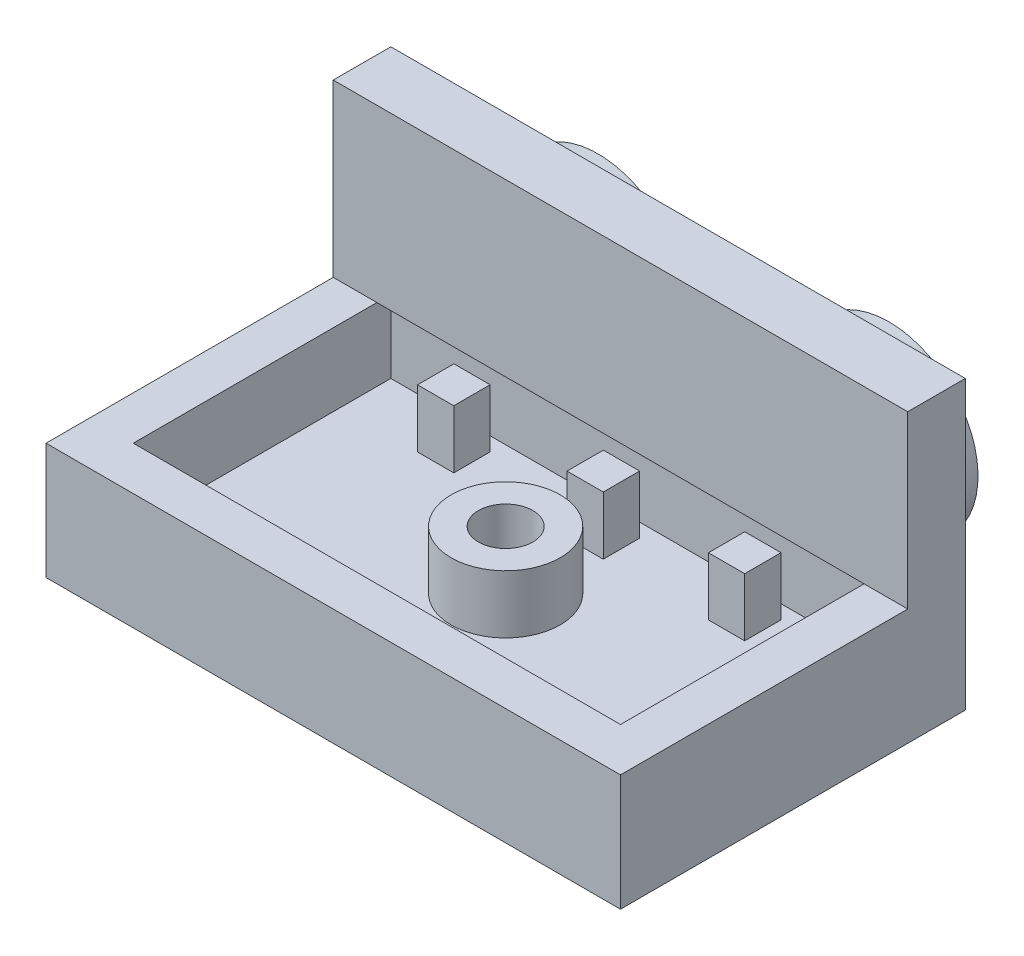
ISO-10303-21;
HEADER;
FILE_DESCRIPTION(('STEP AP214'),'2;1');
FILE_NAME('part.step','',(''),(''),'','','');
FILE_SCHEMA(('AUTOMOTIVE_DESIGN { 1 0 10303 214 1 1 1 1 }'));
ENDSEC;
DATA;
#1=APPLICATION_CONTEXT('core data for automotive mechanical design processes');
#2=APPLICATION_PROTOCOL_DEFINITION('international standard','automotive_design',2000,#1);
#3=PRODUCT_CONTEXT('',#1,'mechanical');
#4=PRODUCT('Part','Part','',(#3));
#5=PRODUCT_RELATED_PRODUCT_CATEGORY('part','',(#4));
#6=PRODUCT_DEFINITION_FORMATION('','',#4);
#7=PRODUCT_DEFINITION_CONTEXT('part definition',#1,'design');
#8=PRODUCT_DEFINITION('design','',#6,#7);
#9=PRODUCT_DEFINITION_SHAPE('','',#8);
#10=(LENGTH_UNIT() NAMED_UNIT(*) SI_UNIT(.MILLI.,.METRE.));
#11=(NAMED_UNIT(*) PLANE_ANGLE_UNIT() SI_UNIT($,.RADIAN.));
#12=(NAMED_UNIT(*) SI_UNIT($,.STERADIAN.) SOLID_ANGLE_UNIT());
#13=UNCERTAINTY_MEASURE_WITH_UNIT(LENGTH_MEASURE(1.E-05),#10,'distance_accuracy_value','');
#14=(GEOMETRIC_REPRESENTATION_CONTEXT(3) GLOBAL_UNCERTAINTY_ASSIGNED_CONTEXT((#13)) GLOBAL_UNIT_ASSIGNED_CONTEXT((#10,
#11,#12)) REPRESENTATION_CONTEXT('',''));
#15=CARTESIAN_POINT('',(0.,0.,0.));
#16=DIRECTION('',(0.,0.,1.));
#17=DIRECTION('',(1.,0.,0.));
#18=AXIS2_PLACEMENT_3D('',#15,#16,#17);
#19=CARTESIAN_POINT('',(0.681967213114738,3.2,7.9));
#20=DIRECTION('',(0.,-1.,0.));
#21=DIRECTION('',(0.,0.,-1.));
#22=AXIS2_PLACEMENT_3D('',#19,#20,#21);
#23=PLANE('',#22);
#24=DIRECTION('',(0.,0.,-1.));
#25=VECTOR('',#24,1.);
#26=CARTESIAN_POINT('',(15.2819672131147,3.2,7.9));
#27=LINE('',#26,#25);
#28=CARTESIAN_POINT('',(15.2819672131147,3.2,6.7));
#29=VERTEX_POINT('',#28);
#30=CARTESIAN_POINT('',(15.2819672131147,3.2,0.));
#31=VERTEX_POINT('',#30);
#32=EDGE_CURVE('E295',#29,#31,#27,.T.);
#33=ORIENTED_EDGE('',*,*,#32,.F.);
#34=DIRECTION('',(-1.,0.,0.));
#35=VECTOR('',#34,1.);
#36=CARTESIAN_POINT('',(0.,3.2,6.7));
#37=LINE('',#36,#35);
#38=CARTESIAN_POINT('',(1.88196721311474,3.2,6.7));
#39=VERTEX_POINT('',#38);
#40=EDGE_CURVE('E303',#29,#39,#37,.T.);
#41=ORIENTED_EDGE('',*,*,#40,.T.);
#42=DIRECTION('',(0.,0.,-1.));
#43=VECTOR('',#42,1.);
#44=CARTESIAN_POINT('',(1.88196721311474,3.2,7.9));
#45=LINE('',#44,#43);
#46=CARTESIAN_POINT('',(1.88196721311474,3.2,0.));
#47=VERTEX_POINT('',#46);
#48=EDGE_CURVE('E319',#39,#47,#45,.T.);
#49=ORIENTED_EDGE('',*,*,#48,.T.);
#50=DIRECTION('',(1.,0.,0.));
#51=VECTOR('',#50,1.);
#52=CARTESIAN_POINT('',(0.681967213114738,3.2,0.));
#53=LINE('',#52,#51);
#54=CARTESIAN_POINT('',(0.681967213114738,3.2,0.));
#55=VERTEX_POINT('',#54);
#56=EDGE_CURVE('E386',#55,#47,#53,.T.);
#57=ORIENTED_EDGE('',*,*,#56,.F.);
#58=DIRECTION('',(0.,0.,-1.));
#59=VECTOR('',#58,1.);
#60=CARTESIAN_POINT('',(0.681967213114738,3.2,7.9));
#61=LINE('',#60,#59);
#62=CARTESIAN_POINT('',(0.681967213114738,3.2,7.9));
#63=VERTEX_POINT('',#62);
#64=EDGE_CURVE('E375',#63,#55,#61,.T.);
#65=ORIENTED_EDGE('',*,*,#64,.F.);
#66=DIRECTION('',(-1.,0.,0.));
#67=VECTOR('',#66,1.);
#68=CARTESIAN_POINT('',(0.681967213114738,3.2,7.9));
#69=LINE('',#68,#67);
#70=CARTESIAN_POINT('',(16.4819672131147,3.2,7.9));
#71=VERTEX_POINT('',#70);
#72=EDGE_CURVE('E373',#71,#63,#69,.T.);
#73=ORIENTED_EDGE('',*,*,#72,.F.);
#74=DIRECTION('',(0.,0.,-1.));
#75=VECTOR('',#74,1.);
#76=CARTESIAN_POINT('',(16.4819672131147,3.2,7.9));
#77=LINE('',#76,#75);
#78=CARTESIAN_POINT('',(16.4819672131147,3.2,0.));
#79=VERTEX_POINT('',#78);
#80=EDGE_CURVE('E378',#71,#79,#77,.T.);
#81=ORIENTED_EDGE('',*,*,#80,.T.);
#82=EDGE_CURVE('E385',#31,#79,#53,.T.);
#83=ORIENTED_EDGE('',*,*,#82,.F.);
#84=EDGE_LOOP('',(#33,#41,#49,#57,#65,#73,#81,#83));
#85=FACE_BOUND('',#84,.T.);
#86=ADVANCED_FACE('F47',(#85),#23,.F.);
#87=CARTESIAN_POINT('',(16.4819672131147,0.,7.9));
#88=DIRECTION('',(-1.,0.,0.));
#89=DIRECTION('',(0.,0.,1.));
#90=AXIS2_PLACEMENT_3D('',#87,#88,#89);
#91=PLANE('',#90);
#92=DIRECTION('',(0.,0.,-1.));
#93=VECTOR('',#92,1.);
#94=CARTESIAN_POINT('',(16.4819672131147,0.,7.9));
#95=LINE('',#94,#93);
#96=CARTESIAN_POINT('',(16.4819672131147,0.,7.9));
#97=VERTEX_POINT('',#96);
#98=CARTESIAN_POINT('',(16.4819672131147,0.,-1.58374582752892));
#99=VERTEX_POINT('',#98);
#100=EDGE_CURVE('E381',#97,#99,#95,.T.);
#101=ORIENTED_EDGE('',*,*,#100,.T.);
#102=DIRECTION('',(0.,1.,0.));
#103=VECTOR('',#102,1.);
#104=CARTESIAN_POINT('',(16.4819672131147,7.9,-1.58374582752892));
#105=LINE('',#104,#103);
#106=CARTESIAN_POINT('',(16.4819672131147,7.9,-1.58374582752892));
#107=VERTEX_POINT('',#106);
#108=EDGE_CURVE('E345',#99,#107,#105,.T.);
#109=ORIENTED_EDGE('',*,*,#108,.T.);
#110=DIRECTION('',(0.,0.,1.));
#111=VECTOR('',#110,1.);
#112=CARTESIAN_POINT('',(16.4819672131147,7.9,-1.58374582752892));
#113=LINE('',#112,#111);
#114=CARTESIAN_POINT('',(16.4819672131147,7.9,0.));
#115=VERTEX_POINT('',#114);
#116=EDGE_CURVE('E351',#107,#115,#113,.T.);
#117=ORIENTED_EDGE('',*,*,#116,.T.);
#118=DIRECTION('',(0.,-1.,0.));
#119=VECTOR('',#118,1.);
#120=CARTESIAN_POINT('',(16.4819672131147,0.,0.));
#121=LINE('',#120,#119);
#122=EDGE_CURVE('E361',#115,#79,#121,.T.);
#123=ORIENTED_EDGE('',*,*,#122,.T.);
#124=ORIENTED_EDGE('',*,*,#80,.F.);
#125=DIRECTION('',(0.,1.,0.));
#126=VECTOR('',#125,1.);
#127=CARTESIAN_POINT('',(16.4819672131147,0.,7.9));
#128=LINE('',#127,#126);
#129=EDGE_CURVE('E371',#97,#71,#128,.T.);
#130=ORIENTED_EDGE('',*,*,#129,.F.);
#131=EDGE_LOOP('',(#101,#109,#117,#123,#124,#130));
#132=FACE_BOUND('',#131,.T.);
#133=ADVANCED_FACE('F410',(#132),#91,.F.);
#134=CARTESIAN_POINT('',(0.681967213114738,0.,7.9));
#135=DIRECTION('',(0.,1.,0.));
#136=DIRECTION('',(0.,0.,1.));
#137=AXIS2_PLACEMENT_3D('',#134,#135,#136);
#138=PLANE('',#137);
#139=CARTESIAN_POINT('',(12.5819672131147,0.,3.15812708623554));
#140=DIRECTION('',(0.,1.,0.));
#141=DIRECTION('',(0.,0.,1.));
#142=AXIS2_PLACEMENT_3D('',#139,#140,#141);
#143=CIRCLE('',#142,2.4);
#144=CARTESIAN_POINT('',(12.5819672131147,0.,5.55812708623554));
#145=VERTEX_POINT('',#144);
#146=EDGE_CURVE('E12',#145,#145,#143,.F.);
#147=ORIENTED_EDGE('',*,*,#146,.F.);
#148=EDGE_LOOP('',(#147));
#149=FACE_BOUND('',#148,.T.);
#150=CARTESIAN_POINT('',(4.58196721311474,0.,3.15812708623554));
#151=DIRECTION('',(0.,1.,0.));
#152=DIRECTION('',(0.,0.,1.));
#153=AXIS2_PLACEMENT_3D('',#150,#151,#152);
#154=CIRCLE('',#153,2.4);
#155=CARTESIAN_POINT('',(4.58196721311474,0.,5.55812708623554));
#156=VERTEX_POINT('',#155);
#157=EDGE_CURVE('E55',#156,#156,#154,.F.);
#158=ORIENTED_EDGE('',*,*,#157,.F.);
#159=EDGE_LOOP('',(#158));
#160=FACE_BOUND('',#159,.T.);
#161=DIRECTION('',(0.,0.,-1.));
#162=VECTOR('',#161,1.);
#163=CARTESIAN_POINT('',(0.681967213114738,0.,7.9));
#164=LINE('',#163,#162);
#165=CARTESIAN_POINT('',(0.681967213114738,0.,7.9));
#166=VERTEX_POINT('',#165);
#167=CARTESIAN_POINT('',(0.68196721311474,0.,-1.58374582752892));
#168=VERTEX_POINT('',#167);
#169=EDGE_CURVE('E383',#166,#168,#164,.T.);
#170=ORIENTED_EDGE('',*,*,#169,.T.);
#171=DIRECTION('',(1.,0.,0.));
#172=VECTOR('',#171,1.);
#173=CARTESIAN_POINT('',(0.68196721311474,0.,-1.58374582752892));
#174=LINE('',#173,#172);
#175=EDGE_CURVE('E348',#168,#99,#174,.T.);
#176=ORIENTED_EDGE('',*,*,#175,.T.);
#177=ORIENTED_EDGE('',*,*,#100,.F.);
#178=DIRECTION('',(1.,0.,0.));
#179=VECTOR('',#178,1.);
#180=CARTESIAN_POINT('',(0.681967213114738,0.,7.9));
#181=LINE('',#180,#179);
#182=EDGE_CURVE('E369',#166,#97,#181,.T.);
#183=ORIENTED_EDGE('',*,*,#182,.F.);
#184=EDGE_LOOP('',(#170,#176,#177,#183));
#185=FACE_BOUND('',#184,.T.);
#186=ADVANCED_FACE('F407',(#149,#160,#185),#138,.F.);
#187=CARTESIAN_POINT('',(0.681967213114738,0.,7.9));
#188=DIRECTION('',(1.,0.,0.));
#189=DIRECTION('',(0.,0.,-1.));
#190=AXIS2_PLACEMENT_3D('',#187,#188,#189);
#191=PLANE('',#190);
#192=ORIENTED_EDGE('',*,*,#64,.T.);
#193=DIRECTION('',(0.,-1.,0.));
#194=VECTOR('',#193,1.);
#195=CARTESIAN_POINT('',(0.68196721311474,0.,0.));
#196=LINE('',#195,#194);
#197=CARTESIAN_POINT('',(0.68196721311474,7.9,0.));
#198=VERTEX_POINT('',#197);
#199=EDGE_CURVE('E354',#198,#55,#196,.T.);
#200=ORIENTED_EDGE('',*,*,#199,.F.);
#201=DIRECTION('',(0.,0.,1.));
#202=VECTOR('',#201,1.);
#203=CARTESIAN_POINT('',(0.68196721311474,7.9,-1.58374582752892));
#204=LINE('',#203,#202);
#205=CARTESIAN_POINT('',(0.68196721311474,7.9,-1.58374582752892));
#206=VERTEX_POINT('',#205);
#207=EDGE_CURVE('E343',#206,#198,#204,.T.);
#208=ORIENTED_EDGE('',*,*,#207,.F.);
#209=DIRECTION('',(0.,1.,0.));
#210=VECTOR('',#209,1.);
#211=CARTESIAN_POINT('',(0.68196721311474,7.9,-1.58374582752892));
#212=LINE('',#211,#210);
#213=EDGE_CURVE('E340',#168,#206,#212,.T.);
#214=ORIENTED_EDGE('',*,*,#213,.F.);
#215=ORIENTED_EDGE('',*,*,#169,.F.);
#216=DIRECTION('',(0.,-1.,0.));
#217=VECTOR('',#216,1.);
#218=CARTESIAN_POINT('',(0.681967213114738,0.,7.9));
#219=LINE('',#218,#217);
#220=EDGE_CURVE('E366',#63,#166,#219,.T.);
#221=ORIENTED_EDGE('',*,*,#220,.F.);
#222=EDGE_LOOP('',(#192,#200,#208,#214,#215,#221));
#223=FACE_BOUND('',#222,.T.);
#224=ADVANCED_FACE('F49',(#223),#191,.F.);
#225=CARTESIAN_POINT('',(0.,0.,7.9));
#226=DIRECTION('',(0.,0.,-1.));
#227=DIRECTION('',(-1.,0.,0.));
#228=AXIS2_PLACEMENT_3D('',#225,#226,#227);
#229=PLANE('',#228);
#230=ORIENTED_EDGE('',*,*,#220,.T.);
#231=ORIENTED_EDGE('',*,*,#182,.T.);
#232=ORIENTED_EDGE('',*,*,#129,.T.);
#233=ORIENTED_EDGE('',*,*,#72,.T.);
#234=EDGE_LOOP('',(#230,#231,#232,#233));
#235=FACE_BOUND('',#234,.T.);
#236=ADVANCED_FACE('F439',(#235),#229,.F.);
#237=CARTESIAN_POINT('',(0.68196721311474,7.9,-1.58374582752892));
#238=DIRECTION('',(0.,0.,-1.));
#239=DIRECTION('',(0.,1.,0.));
#240=AXIS2_PLACEMENT_3D('',#237,#238,#239);
#241=PLANE('',#240);
#242=CARTESIAN_POINT('',(12.5819672131147,3.95,-1.58374582752892));
#243=DIRECTION('',(0.,0.,-1.));
#244=DIRECTION('',(0.,1.,0.));
#245=AXIS2_PLACEMENT_3D('',#242,#243,#244);
#246=CIRCLE('',#245,2.45);
#247=CARTESIAN_POINT('',(12.5819672131147,6.4,-1.58374582752892));
#248=VERTEX_POINT('',#247);
#249=EDGE_CURVE('E344',#248,#248,#246,.F.);
#250=ORIENTED_EDGE('',*,*,#249,.T.);
#251=EDGE_LOOP('',(#250));
#252=FACE_BOUND('',#251,.T.);
#253=CARTESIAN_POINT('',(4.58196721311474,3.95,-1.58374582752892));
#254=DIRECTION('',(0.,0.,-1.));
#255=DIRECTION('',(0.,1.,0.));
#256=AXIS2_PLACEMENT_3D('',#253,#254,#255);
#257=CIRCLE('',#256,2.45);
#258=CARTESIAN_POINT('',(4.58196721311474,6.4,-1.58374582752892));
#259=VERTEX_POINT('',#258);
#260=EDGE_CURVE('E335',#259,#259,#257,.F.);
#261=ORIENTED_EDGE('',*,*,#260,.T.);
#262=EDGE_LOOP('',(#261));
#263=FACE_BOUND('',#262,.T.);
#264=DIRECTION('',(1.,0.,0.));
#265=VECTOR('',#264,1.);
#266=CARTESIAN_POINT('',(0.68196721311474,7.9,-1.58374582752892));
#267=LINE('',#266,#265);
#268=EDGE_CURVE('E347',#206,#107,#267,.T.);
#269=ORIENTED_EDGE('',*,*,#268,.T.);
#270=ORIENTED_EDGE('',*,*,#108,.F.);
#271=ORIENTED_EDGE('',*,*,#175,.F.);
#272=ORIENTED_EDGE('',*,*,#213,.T.);
#273=EDGE_LOOP('',(#269,#270,#271,#272));
#274=FACE_BOUND('',#273,.T.);
#275=ADVANCED_FACE('F421',(#252,#263,#274),#241,.T.);
#276=CARTESIAN_POINT('',(0.68196721311474,7.9,-1.58374582752892));
#277=DIRECTION('',(0.,1.,0.));
#278=DIRECTION('',(0.,0.,1.));
#279=AXIS2_PLACEMENT_3D('',#276,#277,#278);
#280=PLANE('',#279);
#281=DIRECTION('',(1.,0.,0.));
#282=VECTOR('',#281,1.);
#283=CARTESIAN_POINT('',(0.68196721311474,7.9,0.));
#284=LINE('',#283,#282);
#285=EDGE_CURVE('E358',#198,#115,#284,.T.);
#286=ORIENTED_EDGE('',*,*,#285,.T.);
#287=ORIENTED_EDGE('',*,*,#116,.F.);
#288=ORIENTED_EDGE('',*,*,#268,.F.);
#289=ORIENTED_EDGE('',*,*,#207,.T.);
#290=EDGE_LOOP('',(#286,#287,#288,#289));
#291=FACE_BOUND('',#290,.T.);
#292=ADVANCED_FACE('F427',(#291),#280,.T.);
#293=CARTESIAN_POINT('',(0.68196721311474,0.,0.));
#294=DIRECTION('',(0.,0.,1.));
#295=DIRECTION('',(1.,0.,0.));
#296=AXIS2_PLACEMENT_3D('',#293,#294,#295);
#297=PLANE('',#296);
#298=ORIENTED_EDGE('',*,*,#199,.T.);
#299=ORIENTED_EDGE('',*,*,#56,.T.);
#300=EDGE_CURVE('E390',#47,#31,#53,.T.);
#301=ORIENTED_EDGE('',*,*,#300,.T.);
#302=ORIENTED_EDGE('',*,*,#82,.T.);
#303=ORIENTED_EDGE('',*,*,#122,.F.);
#304=ORIENTED_EDGE('',*,*,#285,.F.);
#305=EDGE_LOOP('',(#298,#299,#301,#302,#303,#304));
#306=FACE_BOUND('',#305,.T.);
#307=ADVANCED_FACE('F430',(#306),#297,.T.);
#308=CARTESIAN_POINT('',(4.58196721311474,3.95,-3.38374582752892));
#309=DIRECTION('',(0.,0.,1.));
#310=DIRECTION('',(0.,-1.,0.));
#311=AXIS2_PLACEMENT_3D('',#308,#309,#310);
#312=PLANE('',#311);
#313=CARTESIAN_POINT('',(4.58196721311474,3.95,-3.38374582752892));
#314=DIRECTION('',(0.,0.,-1.));
#315=DIRECTION('',(0.,-1.,0.));
#316=AXIS2_PLACEMENT_3D('',#313,#314,#315);
#317=CIRCLE('',#316,2.45);
#318=CARTESIAN_POINT('',(4.58196721311474,1.5,-3.38374582752892));
#319=VERTEX_POINT('',#318);
#320=EDGE_CURVE('E327',#319,#319,#317,.T.);
#321=ORIENTED_EDGE('',*,*,#320,.T.);
#322=EDGE_LOOP('',(#321));
#323=FACE_BOUND('',#322,.T.);
#324=CARTESIAN_POINT('',(4.58196721311474,3.95,-3.38374582752892));
#325=DIRECTION('',(0.,0.,-1.));
#326=DIRECTION('',(0.,-1.,0.));
#327=AXIS2_PLACEMENT_3D('',#324,#325,#326);
#328=CIRCLE('',#327,2.);
#329=CARTESIAN_POINT('',(4.58196721311474,1.95,-3.38374582752892));
#330=VERTEX_POINT('',#329);
#331=EDGE_CURVE('E332',#330,#330,#328,.T.);
#332=ORIENTED_EDGE('',*,*,#331,.F.);
#333=EDGE_LOOP('',(#332));
#334=FACE_BOUND('',#333,.T.);
#335=ADVANCED_FACE('F450',(#323,#334),#312,.F.);
#336=CARTESIAN_POINT('',(4.58196721311474,3.95,-3.38374582752892));
#337=DIRECTION('',(0.,0.,1.));
#338=DIRECTION('',(0.,-1.,0.));
#339=AXIS2_PLACEMENT_3D('',#336,#337,#338);
#340=CYLINDRICAL_SURFACE('',#339,2.45);
#341=ORIENTED_EDGE('',*,*,#260,.F.);
#342=EDGE_LOOP('',(#341));
#343=FACE_BOUND('',#342,.T.);
#344=ORIENTED_EDGE('',*,*,#320,.F.);
#345=EDGE_LOOP('',(#344));
#346=FACE_BOUND('',#345,.T.);
#347=ADVANCED_FACE('F489',(#343,#346),#340,.T.);
#348=CARTESIAN_POINT('',(4.58196721311474,3.95,-3.38374582752892));
#349=DIRECTION('',(0.,0.,1.));
#350=DIRECTION('',(0.,-1.,0.));
#351=AXIS2_PLACEMENT_3D('',#348,#349,#350);
#352=CYLINDRICAL_SURFACE('',#351,2.);
#353=CARTESIAN_POINT('',(4.58196721311474,3.95,-1.58374582752892));
#354=DIRECTION('',(0.,0.,-1.));
#355=DIRECTION('',(0.,1.,0.));
#356=AXIS2_PLACEMENT_3D('',#353,#354,#355);
#357=CIRCLE('',#356,2.);
#358=CARTESIAN_POINT('',(4.58196721311474,5.95,-1.58374582752892));
#359=VERTEX_POINT('',#358);
#360=EDGE_CURVE('E389',#359,#359,#357,.F.);
#361=ORIENTED_EDGE('',*,*,#360,.T.);
#362=EDGE_LOOP('',(#361));
#363=FACE_BOUND('',#362,.T.);
#364=ORIENTED_EDGE('',*,*,#331,.T.);
#365=EDGE_LOOP('',(#364));
#366=FACE_BOUND('',#365,.T.);
#367=ADVANCED_FACE('F499',(#363,#366),#352,.F.);
#368=ORIENTED_EDGE('',*,*,#360,.F.);
#369=EDGE_LOOP('',(#368));
#370=FACE_BOUND('',#369,.T.);
#371=ADVANCED_FACE('F449',(#370),#241,.T.);
#372=CARTESIAN_POINT('',(12.5819672131147,3.95,-3.38374582752892));
#373=DIRECTION('',(0.,0.,-1.));
#374=DIRECTION('',(0.,1.,0.));
#375=AXIS2_PLACEMENT_3D('',#372,#373,#374);
#376=PLANE('',#375);
#377=CARTESIAN_POINT('',(12.5819672131147,3.95,-3.38374582752892));
#378=DIRECTION('',(0.,0.,-1.));
#379=DIRECTION('',(0.,1.,0.));
#380=AXIS2_PLACEMENT_3D('',#377,#378,#379);
#381=CIRCLE('',#380,2.45);
#382=CARTESIAN_POINT('',(12.5819672131147,6.4,-3.38374582752892));
#383=VERTEX_POINT('',#382);
#384=EDGE_CURVE('E331',#383,#383,#381,.T.);
#385=ORIENTED_EDGE('',*,*,#384,.T.);
#386=EDGE_LOOP('',(#385));
#387=FACE_BOUND('',#386,.T.);
#388=CARTESIAN_POINT('',(12.5819672131147,3.95,-3.38374582752892));
#389=DIRECTION('',(0.,0.,-1.));
#390=DIRECTION('',(0.,1.,0.));
#391=AXIS2_PLACEMENT_3D('',#388,#389,#390);
#392=CIRCLE('',#391,2.);
#393=CARTESIAN_POINT('',(12.5819672131147,5.95,-3.38374582752892));
#394=VERTEX_POINT('',#393);
#395=EDGE_CURVE('E328',#394,#394,#392,.T.);
#396=ORIENTED_EDGE('',*,*,#395,.F.);
#397=EDGE_LOOP('',(#396));
#398=FACE_BOUND('',#397,.T.);
#399=ADVANCED_FACE('F517',(#387,#398),#376,.T.);
#400=CARTESIAN_POINT('',(12.5819672131147,3.95,-3.38374582752892));
#401=DIRECTION('',(0.,0.,1.));
#402=DIRECTION('',(0.,-1.,0.));
#403=AXIS2_PLACEMENT_3D('',#400,#401,#402);
#404=CYLINDRICAL_SURFACE('',#403,2.45);
#405=ORIENTED_EDGE('',*,*,#249,.F.);
#406=EDGE_LOOP('',(#405));
#407=FACE_BOUND('',#406,.T.);
#408=ORIENTED_EDGE('',*,*,#384,.F.);
#409=EDGE_LOOP('',(#408));
#410=FACE_BOUND('',#409,.T.);
#411=ADVANCED_FACE('F525',(#407,#410),#404,.T.);
#412=CARTESIAN_POINT('',(12.5819672131147,3.95,-3.38374582752892));
#413=DIRECTION('',(0.,0.,1.));
#414=DIRECTION('',(0.,-1.,0.));
#415=AXIS2_PLACEMENT_3D('',#412,#413,#414);
#416=CYLINDRICAL_SURFACE('',#415,2.);
#417=CARTESIAN_POINT('',(12.5819672131147,3.95,-1.58374582752892));
#418=DIRECTION('',(0.,0.,-1.));
#419=DIRECTION('',(0.,1.,0.));
#420=AXIS2_PLACEMENT_3D('',#417,#418,#419);
#421=CIRCLE('',#420,2.);
#422=CARTESIAN_POINT('',(12.5819672131147,5.95,-1.58374582752892));
#423=VERTEX_POINT('',#422);
#424=EDGE_CURVE('E393',#423,#423,#421,.F.);
#425=ORIENTED_EDGE('',*,*,#424,.T.);
#426=EDGE_LOOP('',(#425));
#427=FACE_BOUND('',#426,.T.);
#428=ORIENTED_EDGE('',*,*,#395,.T.);
#429=EDGE_LOOP('',(#428));
#430=FACE_BOUND('',#429,.T.);
#431=ADVANCED_FACE('F534',(#427,#430),#416,.F.);
#432=ORIENTED_EDGE('',*,*,#424,.F.);
#433=EDGE_LOOP('',(#432));
#434=FACE_BOUND('',#433,.T.);
#435=ADVANCED_FACE('F448',(#434),#241,.T.);
#436=CARTESIAN_POINT('',(0.681967213114738,3.2,7.9));
#437=DIRECTION('',(0.,-1.,0.));
#438=DIRECTION('',(0.,0.,-1.));
#439=AXIS2_PLACEMENT_3D('',#436,#437,#438);
#440=PLANE('',#439);
#441=CARTESIAN_POINT('',(1.88196721311474,3.2,-0.383745827528924));
#442=VERTEX_POINT('',#441);
#443=EDGE_CURVE('E322',#47,#442,#45,.T.);
#444=ORIENTED_EDGE('',*,*,#443,.T.);
#445=DIRECTION('',(-1.,0.,0.));
#446=VECTOR('',#445,1.);
#447=CARTESIAN_POINT('',(0.68196721311474,3.2,-0.383745827528924));
#448=LINE('',#447,#446);
#449=CARTESIAN_POINT('',(15.2819672131147,3.2,-0.383745827528924));
#450=VERTEX_POINT('',#449);
#451=EDGE_CURVE('E307',#450,#442,#448,.T.);
#452=ORIENTED_EDGE('',*,*,#451,.F.);
#453=EDGE_CURVE('E318',#31,#450,#27,.T.);
#454=ORIENTED_EDGE('',*,*,#453,.F.);
#455=ORIENTED_EDGE('',*,*,#300,.F.);
#456=EDGE_LOOP('',(#444,#452,#454,#455));
#457=FACE_BOUND('',#456,.T.);
#458=ADVANCED_FACE('F548',(#457),#440,.T.);
#459=CARTESIAN_POINT('',(15.2819672131147,0.,7.9));
#460=DIRECTION('',(-1.,0.,0.));
#461=DIRECTION('',(0.,0.,1.));
#462=AXIS2_PLACEMENT_3D('',#459,#460,#461);
#463=PLANE('',#462);
#464=DIRECTION('',(0.,0.,-1.));
#465=VECTOR('',#464,1.);
#466=CARTESIAN_POINT('',(15.2819672131147,1.2,7.9));
#467=LINE('',#466,#465);
#468=CARTESIAN_POINT('',(15.2819672131147,1.2,6.7));
#469=VERTEX_POINT('',#468);
#470=CARTESIAN_POINT('',(15.2819672131147,1.2,-0.383745827528924));
#471=VERTEX_POINT('',#470);
#472=EDGE_CURVE('E291',#469,#471,#467,.T.);
#473=ORIENTED_EDGE('',*,*,#472,.F.);
#474=DIRECTION('',(0.,1.,0.));
#475=VECTOR('',#474,1.);
#476=CARTESIAN_POINT('',(15.2819672131147,0.,6.7));
#477=LINE('',#476,#475);
#478=EDGE_CURVE('E301',#469,#29,#477,.T.);
#479=ORIENTED_EDGE('',*,*,#478,.T.);
#480=ORIENTED_EDGE('',*,*,#32,.T.);
#481=ORIENTED_EDGE('',*,*,#453,.T.);
#482=DIRECTION('',(0.,1.,0.));
#483=VECTOR('',#482,1.);
#484=CARTESIAN_POINT('',(15.2819672131147,7.9,-0.383745827528923));
#485=LINE('',#484,#483);
#486=EDGE_CURVE('E296',#471,#450,#485,.T.);
#487=ORIENTED_EDGE('',*,*,#486,.F.);
#488=EDGE_LOOP('',(#473,#479,#480,#481,#487));
#489=FACE_BOUND('',#488,.T.);
#490=ADVANCED_FACE('F568',(#489),#463,.T.);
#491=CARTESIAN_POINT('',(0.681967213114738,1.2,7.9));
#492=DIRECTION('',(0.,1.,0.));
#493=DIRECTION('',(0.,0.,1.));
#494=AXIS2_PLACEMENT_3D('',#491,#492,#493);
#495=PLANE('',#494);
#496=CARTESIAN_POINT('',(8.58196721311474,1.2,3.15812708623554));
#497=DIRECTION('',(0.,1.,0.));
#498=DIRECTION('',(0.,0.,1.));
#499=AXIS2_PLACEMENT_3D('',#496,#497,#498);
#500=CIRCLE('',#499,1.5);
#501=CARTESIAN_POINT('',(8.58196721311474,1.2,4.65812708623554));
#502=VERTEX_POINT('',#501);
#503=EDGE_CURVE('E398',#502,#502,#500,.T.);
#504=ORIENTED_EDGE('',*,*,#503,.F.);
#505=EDGE_LOOP('',(#504));
#506=FACE_BOUND('',#505,.T.);
#507=DIRECTION('',(0.,0.,1.));
#508=VECTOR('',#507,1.);
#509=CARTESIAN_POINT('',(12.9976987343003,1.2,1.));
#510=LINE('',#509,#508);
#511=CARTESIAN_POINT('',(12.9976987343003,1.2,0.));
#512=VERTEX_POINT('',#511);
#513=CARTESIAN_POINT('',(12.9976987343003,1.2,1.));
#514=VERTEX_POINT('',#513);
#515=EDGE_CURVE('E66',#512,#514,#510,.T.);
#516=ORIENTED_EDGE('',*,*,#515,.T.);
#517=DIRECTION('',(-1.,0.,0.));
#518=VECTOR('',#517,1.);
#519=CARTESIAN_POINT('',(12.9976987343003,1.2,1.));
#520=LINE('',#519,#518);
#521=CARTESIAN_POINT('',(12.0008706359747,1.2,1.));
#522=VERTEX_POINT('',#521);
#523=EDGE_CURVE('E197',#514,#522,#520,.T.);
#524=ORIENTED_EDGE('',*,*,#523,.T.);
#525=DIRECTION('',(0.,0.,-1.));
#526=VECTOR('',#525,1.);
#527=CARTESIAN_POINT('',(12.0008706359747,1.2,0.));
#528=LINE('',#527,#526);
#529=CARTESIAN_POINT('',(12.0008706359747,1.2,0.));
#530=VERTEX_POINT('',#529);
#531=EDGE_CURVE('E201',#522,#530,#528,.T.);
#532=ORIENTED_EDGE('',*,*,#531,.T.);
#533=DIRECTION('',(1.,0.,0.));
#534=VECTOR('',#533,1.);
#535=CARTESIAN_POINT('',(12.9976987343003,1.2,0.));
#536=LINE('',#535,#534);
#537=EDGE_CURVE('E62',#530,#512,#536,.T.);
#538=ORIENTED_EDGE('',*,*,#537,.T.);
#539=EDGE_LOOP('',(#516,#524,#532,#538));
#540=FACE_BOUND('',#539,.T.);
#541=DIRECTION('',(0.,0.,-1.));
#542=VECTOR('',#541,1.);
#543=CARTESIAN_POINT('',(8.11132058851149,1.2,1.));
#544=LINE('',#543,#542);
#545=CARTESIAN_POINT('',(8.11132058851149,1.2,1.));
#546=VERTEX_POINT('',#545);
#547=CARTESIAN_POINT('',(8.11132058851149,1.2,0.));
#548=VERTEX_POINT('',#547);
#549=EDGE_CURVE('E238',#546,#548,#544,.T.);
#550=ORIENTED_EDGE('',*,*,#549,.T.);
#551=DIRECTION('',(1.,0.,0.));
#552=VECTOR('',#551,1.);
#553=CARTESIAN_POINT('',(8.11132058851149,1.2,0.));
#554=LINE('',#553,#552);
#555=CARTESIAN_POINT('',(9.10814868683704,1.2,0.));
#556=VERTEX_POINT('',#555);
#557=EDGE_CURVE('E235',#548,#556,#554,.T.);
#558=ORIENTED_EDGE('',*,*,#557,.T.);
#559=DIRECTION('',(0.,0.,1.));
#560=VECTOR('',#559,1.);
#561=CARTESIAN_POINT('',(9.10814868683704,1.2,0.));
#562=LINE('',#561,#560);
#563=CARTESIAN_POINT('',(9.10814868683704,1.2,1.));
#564=VERTEX_POINT('',#563);
#565=EDGE_CURVE('E242',#556,#564,#562,.T.);
#566=ORIENTED_EDGE('',*,*,#565,.T.);
#567=DIRECTION('',(-1.,0.,0.));
#568=VECTOR('',#567,1.);
#569=CARTESIAN_POINT('',(8.11132058851149,1.2,1.));
#570=LINE('',#569,#568);
#571=EDGE_CURVE('E240',#564,#546,#570,.T.);
#572=ORIENTED_EDGE('',*,*,#571,.T.);
#573=EDGE_LOOP('',(#550,#558,#566,#572));
#574=FACE_BOUND('',#573,.T.);
#575=DIRECTION('',(-1.,0.,0.));
#576=VECTOR('',#575,1.);
#577=CARTESIAN_POINT('',(4.00046581234461,1.2,1.));
#578=LINE('',#577,#576);
#579=CARTESIAN_POINT('',(4.99729391067017,1.2,1.));
#580=VERTEX_POINT('',#579);
#581=CARTESIAN_POINT('',(4.00046581234461,1.2,1.));
#582=VERTEX_POINT('',#581);
#583=EDGE_CURVE('E266',#580,#582,#578,.T.);
#584=ORIENTED_EDGE('',*,*,#583,.T.);
#585=DIRECTION('',(0.,0.,-1.));
#586=VECTOR('',#585,1.);
#587=CARTESIAN_POINT('',(4.00046581234461,1.2,1.));
#588=LINE('',#587,#586);
#589=CARTESIAN_POINT('',(4.00046581234461,1.2,0.));
#590=VERTEX_POINT('',#589);
#591=EDGE_CURVE('E263',#582,#590,#588,.T.);
#592=ORIENTED_EDGE('',*,*,#591,.T.);
#593=DIRECTION('',(1.,0.,0.));
#594=VECTOR('',#593,1.);
#595=CARTESIAN_POINT('',(4.00046581234461,1.2,0.));
#596=LINE('',#595,#594);
#597=CARTESIAN_POINT('',(4.99729391067017,1.2,0.));
#598=VERTEX_POINT('',#597);
#599=EDGE_CURVE('E270',#590,#598,#596,.T.);
#600=ORIENTED_EDGE('',*,*,#599,.T.);
#601=DIRECTION('',(0.,0.,1.));
#602=VECTOR('',#601,1.);
#603=CARTESIAN_POINT('',(4.99729391067017,1.2,0.));
#604=LINE('',#603,#602);
#605=EDGE_CURVE('E268',#598,#580,#604,.T.);
#606=ORIENTED_EDGE('',*,*,#605,.T.);
#607=EDGE_LOOP('',(#584,#592,#600,#606));
#608=FACE_BOUND('',#607,.T.);
#609=DIRECTION('',(0.,0.,-1.));
#610=VECTOR('',#609,1.);
#611=CARTESIAN_POINT('',(1.88196721311474,1.2,7.9));
#612=LINE('',#611,#610);
#613=CARTESIAN_POINT('',(1.88196721311474,1.2,6.7));
#614=VERTEX_POINT('',#613);
#615=CARTESIAN_POINT('',(1.88196721311474,1.2,-0.383745827528924));
#616=VERTEX_POINT('',#615);
#617=EDGE_CURVE('E294',#614,#616,#612,.T.);
#618=ORIENTED_EDGE('',*,*,#617,.F.);
#619=DIRECTION('',(1.,0.,0.));
#620=VECTOR('',#619,1.);
#621=CARTESIAN_POINT('',(0.,1.2,6.7));
#622=LINE('',#621,#620);
#623=EDGE_CURVE('E304',#614,#469,#622,.T.);
#624=ORIENTED_EDGE('',*,*,#623,.T.);
#625=ORIENTED_EDGE('',*,*,#472,.T.);
#626=DIRECTION('',(1.,0.,0.));
#627=VECTOR('',#626,1.);
#628=CARTESIAN_POINT('',(0.68196721311474,1.2,-0.383745827528924));
#629=LINE('',#628,#627);
#630=EDGE_CURVE('E300',#616,#471,#629,.T.);
#631=ORIENTED_EDGE('',*,*,#630,.F.);
#632=EDGE_LOOP('',(#618,#624,#625,#631));
#633=FACE_BOUND('',#632,.T.);
#634=ADVANCED_FACE('F199',(#506,#540,#574,#608,#633),#495,.T.);
#635=CARTESIAN_POINT('',(1.88196721311474,0.,7.9));
#636=DIRECTION('',(1.,0.,0.));
#637=DIRECTION('',(0.,0.,-1.));
#638=AXIS2_PLACEMENT_3D('',#635,#636,#637);
#639=PLANE('',#638);
#640=ORIENTED_EDGE('',*,*,#48,.F.);
#641=DIRECTION('',(0.,-1.,0.));
#642=VECTOR('',#641,1.);
#643=CARTESIAN_POINT('',(1.88196721311474,0.,6.7));
#644=LINE('',#643,#642);
#645=EDGE_CURVE('E299',#39,#614,#644,.T.);
#646=ORIENTED_EDGE('',*,*,#645,.T.);
#647=ORIENTED_EDGE('',*,*,#617,.T.);
#648=DIRECTION('',(0.,1.,0.));
#649=VECTOR('',#648,1.);
#650=CARTESIAN_POINT('',(1.88196721311474,0.,-0.383745827528925));
#651=LINE('',#650,#649);
#652=EDGE_CURVE('E309',#616,#442,#651,.T.);
#653=ORIENTED_EDGE('',*,*,#652,.T.);
#654=ORIENTED_EDGE('',*,*,#443,.F.);
#655=EDGE_LOOP('',(#640,#646,#647,#653,#654));
#656=FACE_BOUND('',#655,.T.);
#657=ADVANCED_FACE('F586',(#656),#639,.T.);
#658=CARTESIAN_POINT('',(0.,0.,6.7));
#659=DIRECTION('',(0.,0.,-1.));
#660=DIRECTION('',(-1.,0.,0.));
#661=AXIS2_PLACEMENT_3D('',#658,#659,#660);
#662=PLANE('',#661);
#663=ORIENTED_EDGE('',*,*,#645,.F.);
#664=ORIENTED_EDGE('',*,*,#40,.F.);
#665=ORIENTED_EDGE('',*,*,#478,.F.);
#666=ORIENTED_EDGE('',*,*,#623,.F.);
#667=EDGE_LOOP('',(#663,#664,#665,#666));
#668=FACE_BOUND('',#667,.T.);
#669=ADVANCED_FACE('F597',(#668),#662,.T.);
#670=CARTESIAN_POINT('',(0.68196721311474,7.9,-0.383745827528923));
#671=DIRECTION('',(0.,0.,-1.));
#672=DIRECTION('',(0.,1.,0.));
#673=AXIS2_PLACEMENT_3D('',#670,#671,#672);
#674=PLANE('',#673);
#675=ORIENTED_EDGE('',*,*,#486,.T.);
#676=ORIENTED_EDGE('',*,*,#451,.T.);
#677=ORIENTED_EDGE('',*,*,#652,.F.);
#678=ORIENTED_EDGE('',*,*,#630,.T.);
#679=EDGE_LOOP('',(#675,#676,#677,#678));
#680=FACE_BOUND('',#679,.T.);
#681=ADVANCED_FACE('F607',(#680),#674,.F.);
#682=CARTESIAN_POINT('',(4.00046581234461,-0.00199999999999983,1.));
#683=DIRECTION('',(0.,0.,1.));
#684=DIRECTION('',(1.,0.,0.));
#685=AXIS2_PLACEMENT_3D('',#682,#683,#684);
#686=PLANE('',#685);
#687=ORIENTED_EDGE('',*,*,#583,.F.);
#688=DIRECTION('',(0.,1.,0.));
#689=VECTOR('',#688,1.);
#690=CARTESIAN_POINT('',(4.99729391067017,-0.00199999999999983,1.));
#691=LINE('',#690,#689);
#692=CARTESIAN_POINT('',(4.99729391067017,2.8,1.));
#693=VERTEX_POINT('',#692);
#694=EDGE_CURVE('E274',#580,#693,#691,.T.);
#695=ORIENTED_EDGE('',*,*,#694,.T.);
#696=DIRECTION('',(1.,0.,0.));
#697=VECTOR('',#696,1.);
#698=CARTESIAN_POINT('',(4.00046581234461,2.8,1.));
#699=LINE('',#698,#697);
#700=CARTESIAN_POINT('',(4.00046581234461,2.8,1.));
#701=VERTEX_POINT('',#700);
#702=EDGE_CURVE('E280',#701,#693,#699,.T.);
#703=ORIENTED_EDGE('',*,*,#702,.F.);
#704=DIRECTION('',(0.,1.,0.));
#705=VECTOR('',#704,1.);
#706=CARTESIAN_POINT('',(4.00046581234461,-0.00199999999999983,1.));
#707=LINE('',#706,#705);
#708=EDGE_CURVE('E265',#582,#701,#707,.T.);
#709=ORIENTED_EDGE('',*,*,#708,.F.);
#710=EDGE_LOOP('',(#687,#695,#703,#709));
#711=FACE_BOUND('',#710,.T.);
#712=ADVANCED_FACE('F616',(#711),#686,.T.);
#713=CARTESIAN_POINT('',(4.99729391067017,-0.00199999999999983,0.));
#714=DIRECTION('',(1.,0.,0.));
#715=DIRECTION('',(0.,0.,-1.));
#716=AXIS2_PLACEMENT_3D('',#713,#714,#715);
#717=PLANE('',#716);
#718=ORIENTED_EDGE('',*,*,#605,.F.);
#719=DIRECTION('',(0.,1.,0.));
#720=VECTOR('',#719,1.);
#721=CARTESIAN_POINT('',(4.99729391067017,-0.00199999999999983,0.));
#722=LINE('',#721,#720);
#723=CARTESIAN_POINT('',(4.99729391067017,2.8,0.));
#724=VERTEX_POINT('',#723);
#725=EDGE_CURVE('E276',#598,#724,#722,.T.);
#726=ORIENTED_EDGE('',*,*,#725,.T.);
#727=DIRECTION('',(0.,0.,-1.));
#728=VECTOR('',#727,1.);
#729=CARTESIAN_POINT('',(4.99729391067017,2.8,0.));
#730=LINE('',#729,#728);
#731=EDGE_CURVE('E286',#693,#724,#730,.T.);
#732=ORIENTED_EDGE('',*,*,#731,.F.);
#733=ORIENTED_EDGE('',*,*,#694,.F.);
#734=EDGE_LOOP('',(#718,#726,#732,#733));
#735=FACE_BOUND('',#734,.T.);
#736=ADVANCED_FACE('F639',(#735),#717,.T.);
#737=CARTESIAN_POINT('',(0.,2.8,0.));
#738=DIRECTION('',(0.,-1.,0.));
#739=DIRECTION('',(0.,0.,-1.));
#740=AXIS2_PLACEMENT_3D('',#737,#738,#739);
#741=PLANE('',#740);
#742=DIRECTION('',(0.,0.,1.));
#743=VECTOR('',#742,1.);
#744=CARTESIAN_POINT('',(4.00046581234461,2.8,1.));
#745=LINE('',#744,#743);
#746=CARTESIAN_POINT('',(4.00046581234461,2.8,0.));
#747=VERTEX_POINT('',#746);
#748=EDGE_CURVE('E244',#747,#701,#745,.T.);
#749=ORIENTED_EDGE('',*,*,#748,.T.);
#750=ORIENTED_EDGE('',*,*,#702,.T.);
#751=ORIENTED_EDGE('',*,*,#731,.T.);
#752=DIRECTION('',(-1.,0.,0.));
#753=VECTOR('',#752,1.);
#754=CARTESIAN_POINT('',(4.00046581234461,2.8,0.));
#755=LINE('',#754,#753);
#756=EDGE_CURVE('E283',#724,#747,#755,.T.);
#757=ORIENTED_EDGE('',*,*,#756,.T.);
#758=EDGE_LOOP('',(#749,#750,#751,#757));
#759=FACE_BOUND('',#758,.T.);
#760=ADVANCED_FACE('F649',(#759),#741,.F.);
#761=CARTESIAN_POINT('',(4.00046581234461,-0.00199999999999983,1.));
#762=DIRECTION('',(-1.,0.,0.));
#763=DIRECTION('',(0.,0.,1.));
#764=AXIS2_PLACEMENT_3D('',#761,#762,#763);
#765=PLANE('',#764);
#766=ORIENTED_EDGE('',*,*,#591,.F.);
#767=ORIENTED_EDGE('',*,*,#708,.T.);
#768=ORIENTED_EDGE('',*,*,#748,.F.);
#769=DIRECTION('',(0.,1.,0.));
#770=VECTOR('',#769,1.);
#771=CARTESIAN_POINT('',(4.00046581234461,-0.00199999999999983,0.));
#772=LINE('',#771,#770);
#773=EDGE_CURVE('E278',#590,#747,#772,.T.);
#774=ORIENTED_EDGE('',*,*,#773,.F.);
#775=EDGE_LOOP('',(#766,#767,#768,#774));
#776=FACE_BOUND('',#775,.T.);
#777=ADVANCED_FACE('F658',(#776),#765,.T.);
#778=CARTESIAN_POINT('',(4.00046581234461,-0.00199999999999983,0.));
#779=DIRECTION('',(0.,0.,-1.));
#780=DIRECTION('',(-1.,0.,0.));
#781=AXIS2_PLACEMENT_3D('',#778,#779,#780);
#782=PLANE('',#781);
#783=ORIENTED_EDGE('',*,*,#599,.F.);
#784=ORIENTED_EDGE('',*,*,#773,.T.);
#785=ORIENTED_EDGE('',*,*,#756,.F.);
#786=ORIENTED_EDGE('',*,*,#725,.F.);
#787=EDGE_LOOP('',(#783,#784,#785,#786));
#788=FACE_BOUND('',#787,.T.);
#789=ADVANCED_FACE('F619',(#788),#782,.T.);
#790=CARTESIAN_POINT('',(8.11132058851149,-0.00199999999999983,1.));
#791=DIRECTION('',(-1.,0.,0.));
#792=DIRECTION('',(0.,0.,1.));
#793=AXIS2_PLACEMENT_3D('',#790,#791,#792);
#794=PLANE('',#793);
#795=ORIENTED_EDGE('',*,*,#549,.F.);
#796=DIRECTION('',(0.,1.,0.));
#797=VECTOR('',#796,1.);
#798=CARTESIAN_POINT('',(8.11132058851149,-0.00199999999999983,1.));
#799=LINE('',#798,#797);
#800=CARTESIAN_POINT('',(8.11132058851149,2.8,1.));
#801=VERTEX_POINT('',#800);
#802=EDGE_CURVE('E245',#546,#801,#799,.T.);
#803=ORIENTED_EDGE('',*,*,#802,.T.);
#804=DIRECTION('',(0.,0.,1.));
#805=VECTOR('',#804,1.);
#806=CARTESIAN_POINT('',(8.11132058851149,2.8,1.));
#807=LINE('',#806,#805);
#808=CARTESIAN_POINT('',(8.11132058851149,2.8,0.));
#809=VERTEX_POINT('',#808);
#810=EDGE_CURVE('E252',#809,#801,#807,.T.);
#811=ORIENTED_EDGE('',*,*,#810,.F.);
#812=DIRECTION('',(0.,1.,0.));
#813=VECTOR('',#812,1.);
#814=CARTESIAN_POINT('',(8.11132058851149,-0.00199999999999983,0.));
#815=LINE('',#814,#813);
#816=EDGE_CURVE('E237',#548,#809,#815,.T.);
#817=ORIENTED_EDGE('',*,*,#816,.F.);
#818=EDGE_LOOP('',(#795,#803,#811,#817));
#819=FACE_BOUND('',#818,.T.);
#820=ADVANCED_FACE('F675',(#819),#794,.T.);
#821=CARTESIAN_POINT('',(8.11132058851149,-0.00199999999999983,1.));
#822=DIRECTION('',(0.,0.,1.));
#823=DIRECTION('',(1.,0.,0.));
#824=AXIS2_PLACEMENT_3D('',#821,#822,#823);
#825=PLANE('',#824);
#826=ORIENTED_EDGE('',*,*,#571,.F.);
#827=DIRECTION('',(0.,1.,0.));
#828=VECTOR('',#827,1.);
#829=CARTESIAN_POINT('',(9.10814868683704,-0.00199999999999983,1.));
#830=LINE('',#829,#828);
#831=CARTESIAN_POINT('',(9.10814868683704,2.8,1.));
#832=VERTEX_POINT('',#831);
#833=EDGE_CURVE('E247',#564,#832,#830,.T.);
#834=ORIENTED_EDGE('',*,*,#833,.T.);
#835=DIRECTION('',(1.,0.,0.));
#836=VECTOR('',#835,1.);
#837=CARTESIAN_POINT('',(8.11132058851149,2.8,1.));
#838=LINE('',#837,#836);
#839=EDGE_CURVE('E258',#801,#832,#838,.T.);
#840=ORIENTED_EDGE('',*,*,#839,.F.);
#841=ORIENTED_EDGE('',*,*,#802,.F.);
#842=EDGE_LOOP('',(#826,#834,#840,#841));
#843=FACE_BOUND('',#842,.T.);
#844=ADVANCED_FACE('F684',(#843),#825,.T.);
#845=CARTESIAN_POINT('',(0.,2.8,0.));
#846=DIRECTION('',(0.,-1.,0.));
#847=DIRECTION('',(0.,0.,-1.));
#848=AXIS2_PLACEMENT_3D('',#845,#846,#847);
#849=PLANE('',#848);
#850=DIRECTION('',(-1.,0.,0.));
#851=VECTOR('',#850,1.);
#852=CARTESIAN_POINT('',(8.11132058851149,2.8,0.));
#853=LINE('',#852,#851);
#854=CARTESIAN_POINT('',(9.10814868683704,2.8,0.));
#855=VERTEX_POINT('',#854);
#856=EDGE_CURVE('E214',#855,#809,#853,.T.);
#857=ORIENTED_EDGE('',*,*,#856,.T.);
#858=ORIENTED_EDGE('',*,*,#810,.T.);
#859=ORIENTED_EDGE('',*,*,#839,.T.);
#860=DIRECTION('',(0.,0.,-1.));
#861=VECTOR('',#860,1.);
#862=CARTESIAN_POINT('',(9.10814868683704,2.8,0.));
#863=LINE('',#862,#861);
#864=EDGE_CURVE('E255',#832,#855,#863,.T.);
#865=ORIENTED_EDGE('',*,*,#864,.T.);
#866=EDGE_LOOP('',(#857,#858,#859,#865));
#867=FACE_BOUND('',#866,.T.);
#868=ADVANCED_FACE('F693',(#867),#849,.F.);
#869=CARTESIAN_POINT('',(8.11132058851149,-0.00199999999999983,0.));
#870=DIRECTION('',(0.,0.,-1.));
#871=DIRECTION('',(-1.,0.,0.));
#872=AXIS2_PLACEMENT_3D('',#869,#870,#871);
#873=PLANE('',#872);
#874=ORIENTED_EDGE('',*,*,#557,.F.);
#875=ORIENTED_EDGE('',*,*,#816,.T.);
#876=ORIENTED_EDGE('',*,*,#856,.F.);
#877=DIRECTION('',(0.,1.,0.));
#878=VECTOR('',#877,1.);
#879=CARTESIAN_POINT('',(9.10814868683704,-0.00199999999999983,0.));
#880=LINE('',#879,#878);
#881=EDGE_CURVE('E250',#556,#855,#880,.T.);
#882=ORIENTED_EDGE('',*,*,#881,.F.);
#883=EDGE_LOOP('',(#874,#875,#876,#882));
#884=FACE_BOUND('',#883,.T.);
#885=ADVANCED_FACE('F702',(#884),#873,.T.);
#886=CARTESIAN_POINT('',(9.10814868683704,-0.00199999999999983,0.));
#887=DIRECTION('',(1.,0.,0.));
#888=DIRECTION('',(0.,0.,-1.));
#889=AXIS2_PLACEMENT_3D('',#886,#887,#888);
#890=PLANE('',#889);
#891=ORIENTED_EDGE('',*,*,#565,.F.);
#892=ORIENTED_EDGE('',*,*,#881,.T.);
#893=ORIENTED_EDGE('',*,*,#864,.F.);
#894=ORIENTED_EDGE('',*,*,#833,.F.);
#895=EDGE_LOOP('',(#891,#892,#893,#894));
#896=FACE_BOUND('',#895,.T.);
#897=ADVANCED_FACE('F642',(#896),#890,.T.);
#898=CARTESIAN_POINT('',(12.9976987343003,-0.00199999999999983,1.));
#899=DIRECTION('',(1.,0.,0.));
#900=DIRECTION('',(0.,0.,-1.));
#901=AXIS2_PLACEMENT_3D('',#898,#899,#900);
#902=PLANE('',#901);
#903=ORIENTED_EDGE('',*,*,#515,.F.);
#904=DIRECTION('',(0.,1.,0.));
#905=VECTOR('',#904,1.);
#906=CARTESIAN_POINT('',(12.9976987343003,-0.00199999999999983,0.));
#907=LINE('',#906,#905);
#908=CARTESIAN_POINT('',(12.9976987343003,2.8,0.));
#909=VERTEX_POINT('',#908);
#910=EDGE_CURVE('E225',#512,#909,#907,.T.);
#911=ORIENTED_EDGE('',*,*,#910,.T.);
#912=DIRECTION('',(0.,0.,-1.));
#913=VECTOR('',#912,1.);
#914=CARTESIAN_POINT('',(12.9976987343003,2.8,1.));
#915=LINE('',#914,#913);
#916=CARTESIAN_POINT('',(12.9976987343003,2.8,1.));
#917=VERTEX_POINT('',#916);
#918=EDGE_CURVE('E220',#917,#909,#915,.T.);
#919=ORIENTED_EDGE('',*,*,#918,.F.);
#920=DIRECTION('',(0.,1.,0.));
#921=VECTOR('',#920,1.);
#922=CARTESIAN_POINT('',(12.9976987343003,-0.00199999999999983,1.));
#923=LINE('',#922,#921);
#924=EDGE_CURVE('E205',#514,#917,#923,.T.);
#925=ORIENTED_EDGE('',*,*,#924,.F.);
#926=EDGE_LOOP('',(#903,#911,#919,#925));
#927=FACE_BOUND('',#926,.T.);
#928=ADVANCED_FACE('F719',(#927),#902,.T.);
#929=CARTESIAN_POINT('',(12.9976987343003,-0.00199999999999983,0.));
#930=DIRECTION('',(0.,0.,-1.));
#931=DIRECTION('',(-1.,0.,0.));
#932=AXIS2_PLACEMENT_3D('',#929,#930,#931);
#933=PLANE('',#932);
#934=ORIENTED_EDGE('',*,*,#537,.F.);
#935=DIRECTION('',(0.,1.,0.));
#936=VECTOR('',#935,1.);
#937=CARTESIAN_POINT('',(12.0008706359747,-0.00199999999999983,0.));
#938=LINE('',#937,#936);
#939=CARTESIAN_POINT('',(12.0008706359747,2.8,0.));
#940=VERTEX_POINT('',#939);
#941=EDGE_CURVE('E213',#530,#940,#938,.T.);
#942=ORIENTED_EDGE('',*,*,#941,.T.);
#943=DIRECTION('',(-1.,0.,0.));
#944=VECTOR('',#943,1.);
#945=CARTESIAN_POINT('',(12.9976987343003,2.8,0.));
#946=LINE('',#945,#944);
#947=EDGE_CURVE('E223',#909,#940,#946,.T.);
#948=ORIENTED_EDGE('',*,*,#947,.F.);
#949=ORIENTED_EDGE('',*,*,#910,.F.);
#950=EDGE_LOOP('',(#934,#942,#948,#949));
#951=FACE_BOUND('',#950,.T.);
#952=ADVANCED_FACE('F728',(#951),#933,.T.);
#953=CARTESIAN_POINT('',(0.,2.8,0.));
#954=DIRECTION('',(0.,1.,0.));
#955=DIRECTION('',(0.,0.,1.));
#956=AXIS2_PLACEMENT_3D('',#953,#954,#955);
#957=PLANE('',#956);
#958=DIRECTION('',(1.,0.,0.));
#959=VECTOR('',#958,1.);
#960=CARTESIAN_POINT('',(12.9976987343003,2.8,1.));
#961=LINE('',#960,#959);
#962=CARTESIAN_POINT('',(12.0008706359747,2.8,1.));
#963=VERTEX_POINT('',#962);
#964=EDGE_CURVE('E219',#963,#917,#961,.T.);
#965=ORIENTED_EDGE('',*,*,#964,.T.);
#966=ORIENTED_EDGE('',*,*,#918,.T.);
#967=ORIENTED_EDGE('',*,*,#947,.T.);
#968=DIRECTION('',(0.,0.,1.));
#969=VECTOR('',#968,1.);
#970=CARTESIAN_POINT('',(12.0008706359747,2.8,0.));
#971=LINE('',#970,#969);
#972=EDGE_CURVE('E231',#940,#963,#971,.T.);
#973=ORIENTED_EDGE('',*,*,#972,.T.);
#974=EDGE_LOOP('',(#965,#966,#967,#973));
#975=FACE_BOUND('',#974,.T.);
#976=ADVANCED_FACE('F737',(#975),#957,.T.);
#977=CARTESIAN_POINT('',(12.9976987343003,-0.00199999999999983,1.));
#978=DIRECTION('',(0.,0.,1.));
#979=DIRECTION('',(1.,0.,0.));
#980=AXIS2_PLACEMENT_3D('',#977,#978,#979);
#981=PLANE('',#980);
#982=ORIENTED_EDGE('',*,*,#523,.F.);
#983=ORIENTED_EDGE('',*,*,#924,.T.);
#984=ORIENTED_EDGE('',*,*,#964,.F.);
#985=DIRECTION('',(0.,1.,0.));
#986=VECTOR('',#985,1.);
#987=CARTESIAN_POINT('',(12.0008706359747,-0.00199999999999983,1.));
#988=LINE('',#987,#986);
#989=EDGE_CURVE('E211',#522,#963,#988,.T.);
#990=ORIENTED_EDGE('',*,*,#989,.F.);
#991=EDGE_LOOP('',(#982,#983,#984,#990));
#992=FACE_BOUND('',#991,.T.);
#993=ADVANCED_FACE('F217',(#992),#981,.T.);
#994=CARTESIAN_POINT('',(12.0008706359747,-0.00199999999999983,0.));
#995=DIRECTION('',(-1.,0.,0.));
#996=DIRECTION('',(0.,0.,1.));
#997=AXIS2_PLACEMENT_3D('',#994,#995,#996);
#998=PLANE('',#997);
#999=ORIENTED_EDGE('',*,*,#531,.F.);
#1000=ORIENTED_EDGE('',*,*,#989,.T.);
#1001=ORIENTED_EDGE('',*,*,#972,.F.);
#1002=ORIENTED_EDGE('',*,*,#941,.F.);
#1003=EDGE_LOOP('',(#999,#1000,#1001,#1002));
#1004=FACE_BOUND('',#1003,.T.);
#1005=ADVANCED_FACE('F209',(#1004),#998,.T.);
#1006=CARTESIAN_POINT('',(8.58196721311474,2.8,3.15812708623554));
#1007=DIRECTION('',(0.,1.,0.));
#1008=DIRECTION('',(0.,0.,1.));
#1009=AXIS2_PLACEMENT_3D('',#1006,#1007,#1008);
#1010=PLANE('',#1009);
#1011=CARTESIAN_POINT('',(8.58196721311474,2.8,3.15812708623554));
#1012=DIRECTION('',(0.,1.,0.));
#1013=DIRECTION('',(0.,0.,1.));
#1014=AXIS2_PLACEMENT_3D('',#1011,#1012,#1013);
#1015=CIRCLE('',#1014,0.75);
#1016=CARTESIAN_POINT('',(8.58196721311474,2.8,3.90812708623554));
#1017=VERTEX_POINT('',#1016);
#1018=EDGE_CURVE('E909',#1017,#1017,#1015,.T.);
#1019=ORIENTED_EDGE('',*,*,#1018,.F.);
#1020=EDGE_LOOP('',(#1019));
#1021=FACE_BOUND('',#1020,.T.);
#1022=CARTESIAN_POINT('',(8.58196721311474,2.8,3.15812708623554));
#1023=DIRECTION('',(0.,1.,0.));
#1024=DIRECTION('',(0.,0.,1.));
#1025=AXIS2_PLACEMENT_3D('',#1022,#1023,#1024);
#1026=CIRCLE('',#1025,1.5);
#1027=CARTESIAN_POINT('',(8.58196721311474,2.8,4.65812708623554));
#1028=VERTEX_POINT('',#1027);
#1029=EDGE_CURVE('E230',#1028,#1028,#1026,.T.);
#1030=ORIENTED_EDGE('',*,*,#1029,.T.);
#1031=EDGE_LOOP('',(#1030));
#1032=FACE_BOUND('',#1031,.T.);
#1033=ADVANCED_FACE('F629',(#1021,#1032),#1010,.T.);
#1034=CARTESIAN_POINT('',(8.58196721311474,-0.00199999999999983,3.15812708623554));
#1035=DIRECTION('',(0.,1.,0.));
#1036=DIRECTION('',(0.,0.,1.));
#1037=AXIS2_PLACEMENT_3D('',#1034,#1035,#1036);
#1038=CYLINDRICAL_SURFACE('',#1037,1.5);
#1039=ORIENTED_EDGE('',*,*,#503,.T.);
#1040=EDGE_LOOP('',(#1039));
#1041=FACE_BOUND('',#1040,.T.);
#1042=ORIENTED_EDGE('',*,*,#1029,.F.);
#1043=EDGE_LOOP('',(#1042));
#1044=FACE_BOUND('',#1043,.T.);
#1045=ADVANCED_FACE('F768',(#1041,#1044),#1038,.T.);
#1046=CARTESIAN_POINT('',(8.58196721311474,-0.00199999999999983,3.15812708623554));
#1047=DIRECTION('',(0.,1.,0.));
#1048=DIRECTION('',(0.,0.,1.));
#1049=AXIS2_PLACEMENT_3D('',#1046,#1047,#1048);
#1050=CYLINDRICAL_SURFACE('',#1049,0.75);
#1051=CARTESIAN_POINT('',(8.58196721311474,1.2,3.15812708623554));
#1052=DIRECTION('',(0.,1.,0.));
#1053=DIRECTION('',(0.,0.,1.));
#1054=AXIS2_PLACEMENT_3D('',#1051,#1052,#1053);
#1055=CIRCLE('',#1054,0.75);
#1056=CARTESIAN_POINT('',(8.58196721311474,1.2,3.90812708623554));
#1057=VERTEX_POINT('',#1056);
#1058=EDGE_CURVE('E313',#1057,#1057,#1055,.F.);
#1059=ORIENTED_EDGE('',*,*,#1058,.T.);
#1060=EDGE_LOOP('',(#1059));
#1061=FACE_BOUND('',#1060,.T.);
#1062=ORIENTED_EDGE('',*,*,#1018,.T.);
#1063=EDGE_LOOP('',(#1062));
#1064=FACE_BOUND('',#1063,.T.);
#1065=ADVANCED_FACE('F627',(#1061,#1064),#1050,.F.);
#1066=ORIENTED_EDGE('',*,*,#1058,.F.);
#1067=EDGE_LOOP('',(#1066));
#1068=FACE_BOUND('',#1067,.T.);
#1069=ADVANCED_FACE('F589',(#1068),#495,.T.);
#1070=CARTESIAN_POINT('',(4.58196721311474,-1.5,3.15812708623554));
#1071=DIRECTION('',(0.,1.,0.));
#1072=DIRECTION('',(0.,0.,1.));
#1073=AXIS2_PLACEMENT_3D('',#1070,#1071,#1072);
#1074=CYLINDRICAL_SURFACE('',#1073,2.4);
#1075=CARTESIAN_POINT('',(4.58196721311474,-1.5,3.15812708623554));
#1076=DIRECTION('',(0.,-1.,0.));
#1077=DIRECTION('',(0.,0.,-1.));
#1078=AXIS2_PLACEMENT_3D('',#1075,#1076,#1077);
#1079=CIRCLE('',#1078,2.4);
#1080=CARTESIAN_POINT('',(4.58196721311474,-1.5,0.758127086235541));
#1081=VERTEX_POINT('',#1080);
#1082=EDGE_CURVE('E904',#1081,#1081,#1079,.T.);
#1083=ORIENTED_EDGE('',*,*,#1082,.F.);
#1084=EDGE_LOOP('',(#1083));
#1085=FACE_BOUND('',#1084,.T.);
#1086=ORIENTED_EDGE('',*,*,#157,.T.);
#1087=EDGE_LOOP('',(#1086));
#1088=FACE_BOUND('',#1087,.T.);
#1089=ADVANCED_FACE('F405',(#1085,#1088),#1074,.T.);
#1090=CARTESIAN_POINT('',(4.58196721311474,-1.5,3.15812708623554));
#1091=DIRECTION('',(0.,-1.,0.));
#1092=DIRECTION('',(0.,0.,-1.));
#1093=AXIS2_PLACEMENT_3D('',#1090,#1091,#1092);
#1094=PLANE('',#1093);
#1095=ORIENTED_EDGE('',*,*,#1082,.T.);
#1096=EDGE_LOOP('',(#1095));
#1097=FACE_BOUND('',#1096,.T.);
#1098=ADVANCED_FACE('F792',(#1097),#1094,.T.);
#1099=CARTESIAN_POINT('',(12.5819672131147,-1.5,3.15812708623554));
#1100=DIRECTION('',(0.,1.,0.));
#1101=DIRECTION('',(0.,0.,1.));
#1102=AXIS2_PLACEMENT_3D('',#1099,#1100,#1101);
#1103=CYLINDRICAL_SURFACE('',#1102,2.4);
#1104=CARTESIAN_POINT('',(12.5819672131147,-1.5,3.15812708623554));
#1105=DIRECTION('',(0.,-1.,0.));
#1106=DIRECTION('',(0.,0.,-1.));
#1107=AXIS2_PLACEMENT_3D('',#1104,#1105,#1106);
#1108=CIRCLE('',#1107,2.4);
#1109=CARTESIAN_POINT('',(12.5819672131147,-1.5,0.758127086235542));
#1110=VERTEX_POINT('',#1109);
#1111=EDGE_CURVE('E272',#1110,#1110,#1108,.T.);
#1112=ORIENTED_EDGE('',*,*,#1111,.F.);
#1113=EDGE_LOOP('',(#1112));
#1114=FACE_BOUND('',#1113,.T.);
#1115=ORIENTED_EDGE('',*,*,#146,.T.);
#1116=EDGE_LOOP('',(#1115));
#1117=FACE_BOUND('',#1116,.T.);
#1118=ADVANCED_FACE('F801',(#1114,#1117),#1103,.T.);
#1119=CARTESIAN_POINT('',(12.5819672131147,-1.5,3.15812708623554));
#1120=DIRECTION('',(0.,-1.,0.));
#1121=DIRECTION('',(0.,0.,-1.));
#1122=AXIS2_PLACEMENT_3D('',#1119,#1120,#1121);
#1123=PLANE('',#1122);
#1124=ORIENTED_EDGE('',*,*,#1111,.T.);
#1125=EDGE_LOOP('',(#1124));
#1126=FACE_BOUND('',#1125,.T.);
#1127=ADVANCED_FACE('F810',(#1126),#1123,.T.);
#1128=CLOSED_SHELL('',(#86,#133,#186,#224,#236,#275,#292,#307,#335,#347,#367,#371,#399,#411,
#431,#435,#458,#490,#634,#657,#669,#681,#712,#736,#760,#777,#789,#820,#844,#868,#885,#897,#928,
#952,#976,#993,#1005,#1033,#1045,#1065,#1069,#1089,#1098,#1118,#1127));
#1129=MANIFOLD_SOLID_BREP('B2',#1128);
#1130=ADVANCED_BREP_SHAPE_REPRESENTATION('',(#18,#1129),#14);
#1131=SHAPE_DEFINITION_REPRESENTATION(#9,#1130);
ENDSEC;
END-ISO-10303-21;
